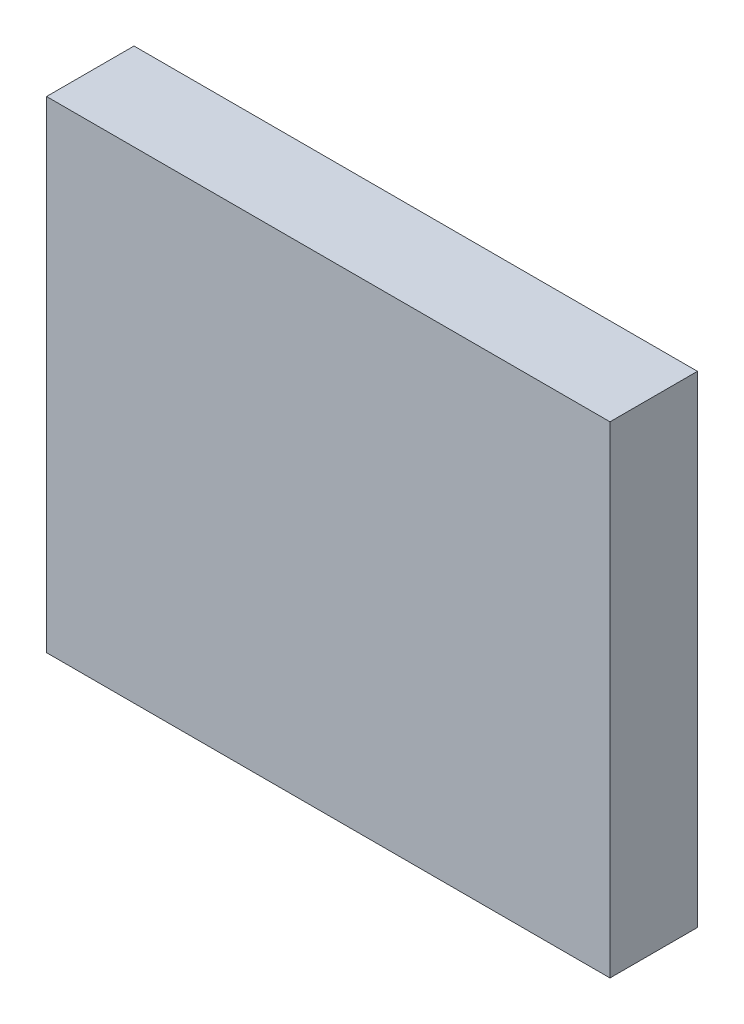
ISO-10303-21;
HEADER;
FILE_DESCRIPTION(('STEP AP214'),'2;1');
FILE_NAME('part.step','',(''),(''),'','','');
FILE_SCHEMA(('AUTOMOTIVE_DESIGN { 1 0 10303 214 1 1 1 1 }'));
ENDSEC;
DATA;
#1=APPLICATION_CONTEXT('core data for automotive mechanical design processes');
#2=APPLICATION_PROTOCOL_DEFINITION('international standard','automotive_design',2000,#1);
#3=PRODUCT_CONTEXT('',#1,'mechanical');
#4=PRODUCT('Part','Part','',(#3));
#5=PRODUCT_RELATED_PRODUCT_CATEGORY('part','',(#4));
#6=PRODUCT_DEFINITION_FORMATION('','',#4);
#7=PRODUCT_DEFINITION_CONTEXT('part definition',#1,'design');
#8=PRODUCT_DEFINITION('design','',#6,#7);
#9=PRODUCT_DEFINITION_SHAPE('','',#8);
#10=(LENGTH_UNIT() NAMED_UNIT(*) SI_UNIT(.MILLI.,.METRE.));
#11=(NAMED_UNIT(*) PLANE_ANGLE_UNIT() SI_UNIT($,.RADIAN.));
#12=(NAMED_UNIT(*) SI_UNIT($,.STERADIAN.) SOLID_ANGLE_UNIT());
#13=UNCERTAINTY_MEASURE_WITH_UNIT(LENGTH_MEASURE(1.E-05),#10,'distance_accuracy_value','');
#14=(GEOMETRIC_REPRESENTATION_CONTEXT(3) GLOBAL_UNCERTAINTY_ASSIGNED_CONTEXT((#13)) GLOBAL_UNIT_ASSIGNED_CONTEXT((#10,
#11,#12)) REPRESENTATION_CONTEXT('',''));
#15=CARTESIAN_POINT('',(0.,0.,0.));
#16=DIRECTION('',(0.,0.,1.));
#17=DIRECTION('',(1.,0.,0.));
#18=AXIS2_PLACEMENT_3D('',#15,#16,#17);
#19=CARTESIAN_POINT('',(-37.4403511466827,25.3678524374177,10.));
#20=DIRECTION('',(1.,0.,0.));
#21=DIRECTION('',(0.,0.,-1.));
#22=AXIS2_PLACEMENT_3D('',#19,#20,#21);
#23=PLANE('',#22);
#24=DIRECTION('',(0.,-1.,0.));
#25=VECTOR('',#24,1.);
#26=CARTESIAN_POINT('',(-37.4403511466827,25.3678524374177,0.));
#27=LINE('',#26,#25);
#28=CARTESIAN_POINT('',(-37.4403511466827,25.3678524374177,0.));
#29=VERTEX_POINT('',#28);
#30=CARTESIAN_POINT('',(-37.4403511466827,-29.7070903543444,0.));
#31=VERTEX_POINT('',#30);
#32=EDGE_CURVE('E95',#29,#31,#27,.T.);
#33=ORIENTED_EDGE('',*,*,#32,.T.);
#34=DIRECTION('',(0.,0.,-1.));
#35=VECTOR('',#34,1.);
#36=CARTESIAN_POINT('',(-37.4403511466827,-29.7070903543444,10.));
#37=LINE('',#36,#35);
#38=CARTESIAN_POINT('',(-37.4403511466827,-29.7070903543444,10.));
#39=VERTEX_POINT('',#38);
#40=EDGE_CURVE('E11',#39,#31,#37,.T.);
#41=ORIENTED_EDGE('',*,*,#40,.F.);
#42=DIRECTION('',(0.,-1.,0.));
#43=VECTOR('',#42,1.);
#44=CARTESIAN_POINT('',(-37.4403511466827,25.3678524374177,10.));
#45=LINE('',#44,#43);
#46=CARTESIAN_POINT('',(-37.4403511466827,25.3678524374177,10.));
#47=VERTEX_POINT('',#46);
#48=EDGE_CURVE('E83',#47,#39,#45,.T.);
#49=ORIENTED_EDGE('',*,*,#48,.F.);
#50=DIRECTION('',(0.,0.,-1.));
#51=VECTOR('',#50,1.);
#52=CARTESIAN_POINT('',(-37.4403511466827,25.3678524374177,10.));
#53=LINE('',#52,#51);
#54=EDGE_CURVE('E91',#47,#29,#53,.T.);
#55=ORIENTED_EDGE('',*,*,#54,.T.);
#56=EDGE_LOOP('',(#33,#41,#49,#55));
#57=FACE_BOUND('',#56,.T.);
#58=ADVANCED_FACE('F32',(#57),#23,.F.);
#59=CARTESIAN_POINT('',(-37.4403511466827,-29.7070903543444,10.));
#60=DIRECTION('',(0.,1.,0.));
#61=DIRECTION('',(0.,0.,1.));
#62=AXIS2_PLACEMENT_3D('',#59,#60,#61);
#63=PLANE('',#62);
#64=DIRECTION('',(1.,0.,0.));
#65=VECTOR('',#64,1.);
#66=CARTESIAN_POINT('',(-37.4403511466827,-29.7070903543444,0.));
#67=LINE('',#66,#65);
#68=CARTESIAN_POINT('',(26.9806425430753,-29.7070903543444,0.));
#69=VERTEX_POINT('',#68);
#70=EDGE_CURVE('E87',#31,#69,#67,.T.);
#71=ORIENTED_EDGE('',*,*,#70,.T.);
#72=DIRECTION('',(0.,0.,-1.));
#73=VECTOR('',#72,1.);
#74=CARTESIAN_POINT('',(26.9806425430753,-29.7070903543444,10.));
#75=LINE('',#74,#73);
#76=CARTESIAN_POINT('',(26.9806425430753,-29.7070903543444,10.));
#77=VERTEX_POINT('',#76);
#78=EDGE_CURVE('E40',#77,#69,#75,.T.);
#79=ORIENTED_EDGE('',*,*,#78,.F.);
#80=DIRECTION('',(1.,0.,0.));
#81=VECTOR('',#80,1.);
#82=CARTESIAN_POINT('',(-37.4403511466827,-29.7070903543444,10.));
#83=LINE('',#82,#81);
#84=EDGE_CURVE('E78',#39,#77,#83,.T.);
#85=ORIENTED_EDGE('',*,*,#84,.F.);
#86=ORIENTED_EDGE('',*,*,#40,.T.);
#87=EDGE_LOOP('',(#71,#79,#85,#86));
#88=FACE_BOUND('',#87,.T.);
#89=ADVANCED_FACE('F86',(#88),#63,.F.);
#90=CARTESIAN_POINT('',(26.9806425430753,25.3678524374177,10.));
#91=DIRECTION('',(-1.,0.,0.));
#92=DIRECTION('',(0.,0.,1.));
#93=AXIS2_PLACEMENT_3D('',#90,#91,#92);
#94=PLANE('',#93);
#95=DIRECTION('',(0.,1.,0.));
#96=VECTOR('',#95,1.);
#97=CARTESIAN_POINT('',(26.9806425430753,25.3678524374177,0.));
#98=LINE('',#97,#96);
#99=CARTESIAN_POINT('',(26.9806425430753,25.3678524374177,0.));
#100=VERTEX_POINT('',#99);
#101=EDGE_CURVE('E65',#69,#100,#98,.T.);
#102=ORIENTED_EDGE('',*,*,#101,.T.);
#103=DIRECTION('',(0.,0.,-1.));
#104=VECTOR('',#103,1.);
#105=CARTESIAN_POINT('',(26.9806425430753,25.3678524374177,10.));
#106=LINE('',#105,#104);
#107=CARTESIAN_POINT('',(26.9806425430753,25.3678524374177,10.));
#108=VERTEX_POINT('',#107);
#109=EDGE_CURVE('E88',#108,#100,#106,.T.);
#110=ORIENTED_EDGE('',*,*,#109,.F.);
#111=DIRECTION('',(0.,1.,0.));
#112=VECTOR('',#111,1.);
#113=CARTESIAN_POINT('',(26.9806425430753,25.3678524374177,10.));
#114=LINE('',#113,#112);
#115=EDGE_CURVE('E81',#77,#108,#114,.T.);
#116=ORIENTED_EDGE('',*,*,#115,.F.);
#117=ORIENTED_EDGE('',*,*,#78,.T.);
#118=EDGE_LOOP('',(#102,#110,#116,#117));
#119=FACE_BOUND('',#118,.T.);
#120=ADVANCED_FACE('F89',(#119),#94,.F.);
#121=CARTESIAN_POINT('',(-37.4403511466827,25.3678524374177,10.));
#122=DIRECTION('',(0.,-1.,0.));
#123=DIRECTION('',(0.,0.,-1.));
#124=AXIS2_PLACEMENT_3D('',#121,#122,#123);
#125=PLANE('',#124);
#126=DIRECTION('',(-1.,0.,0.));
#127=VECTOR('',#126,1.);
#128=CARTESIAN_POINT('',(-37.4403511466827,25.3678524374177,0.));
#129=LINE('',#128,#127);
#130=EDGE_CURVE('E71',#100,#29,#129,.T.);
#131=ORIENTED_EDGE('',*,*,#130,.T.);
#132=ORIENTED_EDGE('',*,*,#54,.F.);
#133=DIRECTION('',(-1.,0.,0.));
#134=VECTOR('',#133,1.);
#135=CARTESIAN_POINT('',(-37.4403511466827,25.3678524374177,10.));
#136=LINE('',#135,#134);
#137=EDGE_CURVE('E48',#108,#47,#136,.T.);
#138=ORIENTED_EDGE('',*,*,#137,.F.);
#139=ORIENTED_EDGE('',*,*,#109,.T.);
#140=EDGE_LOOP('',(#131,#132,#138,#139));
#141=FACE_BOUND('',#140,.T.);
#142=ADVANCED_FACE('F102',(#141),#125,.F.);
#143=CARTESIAN_POINT('',(-37.4403511466827,-29.7070903543444,10.));
#144=DIRECTION('',(0.,0.,1.));
#145=DIRECTION('',(1.,0.,0.));
#146=AXIS2_PLACEMENT_3D('',#143,#144,#145);
#147=PLANE('',#146);
#148=ORIENTED_EDGE('',*,*,#48,.T.);
#149=ORIENTED_EDGE('',*,*,#84,.T.);
#150=ORIENTED_EDGE('',*,*,#115,.T.);
#151=ORIENTED_EDGE('',*,*,#137,.T.);
#152=EDGE_LOOP('',(#148,#149,#150,#151));
#153=FACE_BOUND('',#152,.T.);
#154=ADVANCED_FACE('F79',(#153),#147,.T.);
#155=CARTESIAN_POINT('',(-37.4403511466827,-29.7070903543444,0.));
#156=DIRECTION('',(0.,0.,1.));
#157=DIRECTION('',(1.,0.,0.));
#158=AXIS2_PLACEMENT_3D('',#155,#156,#157);
#159=PLANE('',#158);
#160=ORIENTED_EDGE('',*,*,#32,.F.);
#161=ORIENTED_EDGE('',*,*,#130,.F.);
#162=ORIENTED_EDGE('',*,*,#101,.F.);
#163=ORIENTED_EDGE('',*,*,#70,.F.);
#164=EDGE_LOOP('',(#160,#161,#162,#163));
#165=FACE_BOUND('',#164,.T.);
#166=ADVANCED_FACE('F105',(#165),#159,.F.);
#167=CLOSED_SHELL('',(#58,#89,#120,#142,#154,#166));
#168=MANIFOLD_SOLID_BREP('B2',#167);
#169=ADVANCED_BREP_SHAPE_REPRESENTATION('',(#18,#168),#14);
#170=SHAPE_DEFINITION_REPRESENTATION(#9,#169);
ENDSEC;
END-ISO-10303-21;
